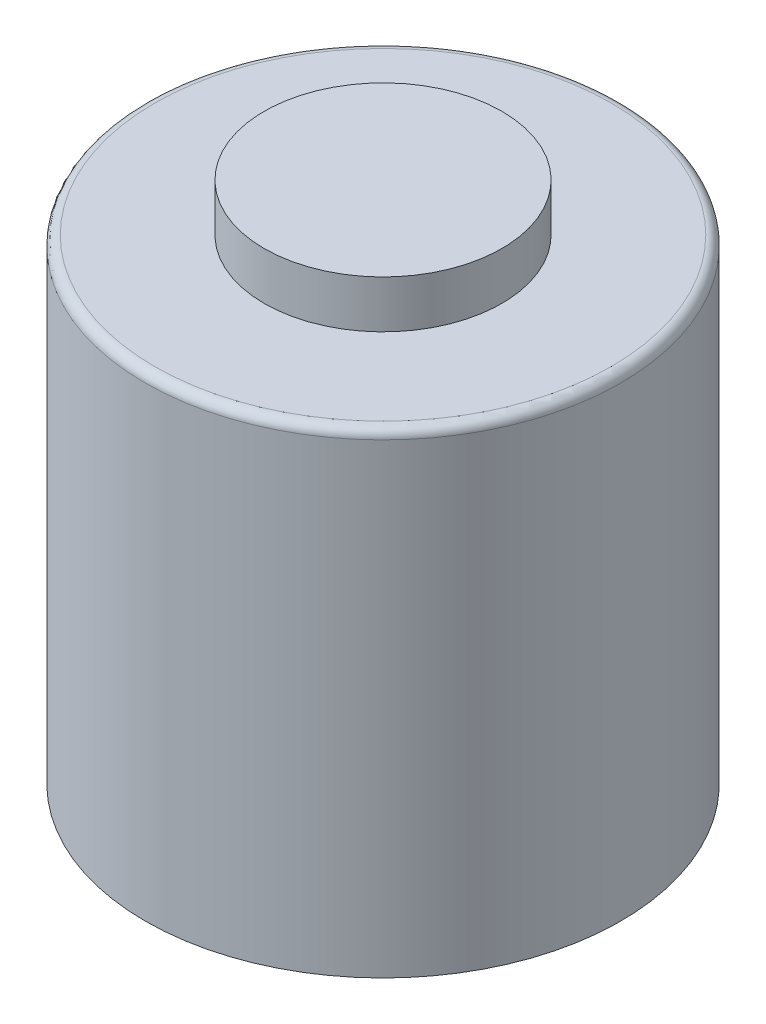
ISO-10303-21;
HEADER;
FILE_DESCRIPTION(('STEP AP214'),'2;1');
FILE_NAME('part.step','',(''),(''),'','','');
FILE_SCHEMA(('AUTOMOTIVE_DESIGN { 1 0 10303 214 1 1 1 1 }'));
ENDSEC;
DATA;
#1=APPLICATION_CONTEXT('core data for automotive mechanical design processes');
#2=APPLICATION_PROTOCOL_DEFINITION('international standard','automotive_design',2000,#1);
#3=PRODUCT_CONTEXT('',#1,'mechanical');
#4=PRODUCT('Part','Part','',(#3));
#5=PRODUCT_RELATED_PRODUCT_CATEGORY('part','',(#4));
#6=PRODUCT_DEFINITION_FORMATION('','',#4);
#7=PRODUCT_DEFINITION_CONTEXT('part definition',#1,'design');
#8=PRODUCT_DEFINITION('design','',#6,#7);
#9=PRODUCT_DEFINITION_SHAPE('','',#8);
#10=(LENGTH_UNIT() NAMED_UNIT(*) SI_UNIT(.MILLI.,.METRE.));
#11=(NAMED_UNIT(*) PLANE_ANGLE_UNIT() SI_UNIT($,.RADIAN.));
#12=(NAMED_UNIT(*) SI_UNIT($,.STERADIAN.) SOLID_ANGLE_UNIT());
#13=UNCERTAINTY_MEASURE_WITH_UNIT(LENGTH_MEASURE(1.E-05),#10,'distance_accuracy_value','');
#14=(GEOMETRIC_REPRESENTATION_CONTEXT(3) GLOBAL_UNCERTAINTY_ASSIGNED_CONTEXT((#13)) GLOBAL_UNIT_ASSIGNED_CONTEXT((#10,
#11,#12)) REPRESENTATION_CONTEXT('',''));
#15=CARTESIAN_POINT('',(0.,0.,0.));
#16=DIRECTION('',(0.,0.,1.));
#17=DIRECTION('',(1.,0.,0.));
#18=AXIS2_PLACEMENT_3D('',#15,#16,#17);
#19=CARTESIAN_POINT('',(0.,500.,0.));
#20=DIRECTION('',(0.,-1.,0.));
#21=DIRECTION('',(0.,0.,-1.));
#22=AXIS2_PLACEMENT_3D('',#19,#20,#21);
#23=CYLINDRICAL_SURFACE('',#22,250.);
#24=CARTESIAN_POINT('',(0.,490.,0.));
#25=DIRECTION('',(0.,1.,0.));
#26=DIRECTION('',(0.,0.,1.));
#27=AXIS2_PLACEMENT_3D('',#24,#25,#26);
#28=CIRCLE('',#27,250.);
#29=CARTESIAN_POINT('',(0.,490.,250.));
#30=VERTEX_POINT('',#29);
#31=EDGE_CURVE('E10',#30,#30,#28,.F.);
#32=ORIENTED_EDGE('',*,*,#31,.T.);
#33=EDGE_LOOP('',(#32));
#34=FACE_BOUND('',#33,.T.);
#35=CARTESIAN_POINT('',(0.,0.,0.));
#36=DIRECTION('',(0.,1.,0.));
#37=DIRECTION('',(0.,0.,1.));
#38=AXIS2_PLACEMENT_3D('',#35,#36,#37);
#39=CIRCLE('',#38,250.);
#40=CARTESIAN_POINT('',(0.,0.,250.));
#41=VERTEX_POINT('',#40);
#42=EDGE_CURVE('E52',#41,#41,#39,.T.);
#43=ORIENTED_EDGE('',*,*,#42,.T.);
#44=EDGE_LOOP('',(#43));
#45=FACE_BOUND('',#44,.T.);
#46=ADVANCED_FACE('F37',(#34,#45),#23,.T.);
#47=CARTESIAN_POINT('',(0.,500.,0.));
#48=DIRECTION('',(0.,1.,0.));
#49=DIRECTION('',(0.,0.,1.));
#50=AXIS2_PLACEMENT_3D('',#47,#48,#49);
#51=PLANE('',#50);
#52=CARTESIAN_POINT('',(0.,500.,0.));
#53=DIRECTION('',(0.,1.,0.));
#54=DIRECTION('',(0.,0.,1.));
#55=AXIS2_PLACEMENT_3D('',#52,#53,#54);
#56=CIRCLE('',#55,240.);
#57=CARTESIAN_POINT('',(0.,500.,240.));
#58=VERTEX_POINT('',#57);
#59=EDGE_CURVE('E44',#58,#58,#56,.T.);
#60=ORIENTED_EDGE('',*,*,#59,.T.);
#61=EDGE_LOOP('',(#60));
#62=FACE_BOUND('',#61,.T.);
#63=CARTESIAN_POINT('',(0.,500.,0.));
#64=DIRECTION('',(0.,1.,0.));
#65=DIRECTION('',(0.,0.,1.));
#66=AXIS2_PLACEMENT_3D('',#63,#64,#65);
#67=CIRCLE('',#66,125.);
#68=CARTESIAN_POINT('',(0.,500.,125.));
#69=VERTEX_POINT('',#68);
#70=EDGE_CURVE('E48',#69,#69,#67,.T.);
#71=ORIENTED_EDGE('',*,*,#70,.F.);
#72=EDGE_LOOP('',(#71));
#73=FACE_BOUND('',#72,.T.);
#74=ADVANCED_FACE('F70',(#62,#73),#51,.T.);
#75=CARTESIAN_POINT('',(0.,0.,0.));
#76=DIRECTION('',(0.,1.,0.));
#77=DIRECTION('',(0.,0.,1.));
#78=AXIS2_PLACEMENT_3D('',#75,#76,#77);
#79=PLANE('',#78);
#80=ORIENTED_EDGE('',*,*,#42,.F.);
#81=EDGE_LOOP('',(#80));
#82=FACE_BOUND('',#81,.T.);
#83=ADVANCED_FACE('F66',(#82),#79,.F.);
#84=CARTESIAN_POINT('',(0.,550.,0.));
#85=DIRECTION('',(0.,-1.,0.));
#86=DIRECTION('',(0.,0.,-1.));
#87=AXIS2_PLACEMENT_3D('',#84,#85,#86);
#88=CYLINDRICAL_SURFACE('',#87,125.);
#89=CARTESIAN_POINT('',(0.,550.,0.));
#90=DIRECTION('',(0.,1.,0.));
#91=DIRECTION('',(0.,0.,1.));
#92=AXIS2_PLACEMENT_3D('',#89,#90,#91);
#93=CIRCLE('',#92,125.);
#94=CARTESIAN_POINT('',(0.,550.,125.));
#95=VERTEX_POINT('',#94);
#96=EDGE_CURVE('E56',#95,#95,#93,.T.);
#97=ORIENTED_EDGE('',*,*,#96,.F.);
#98=EDGE_LOOP('',(#97));
#99=FACE_BOUND('',#98,.T.);
#100=ORIENTED_EDGE('',*,*,#70,.T.);
#101=EDGE_LOOP('',(#100));
#102=FACE_BOUND('',#101,.T.);
#103=ADVANCED_FACE('F63',(#99,#102),#88,.T.);
#104=CARTESIAN_POINT('',(0.,550.,0.));
#105=DIRECTION('',(0.,1.,0.));
#106=DIRECTION('',(0.,0.,1.));
#107=AXIS2_PLACEMENT_3D('',#104,#105,#106);
#108=PLANE('',#107);
#109=ORIENTED_EDGE('',*,*,#96,.T.);
#110=EDGE_LOOP('',(#109));
#111=FACE_BOUND('',#110,.T.);
#112=ADVANCED_FACE('F61',(#111),#108,.T.);
#113=CARTESIAN_POINT('',(0.,490.,0.));
#114=DIRECTION('',(0.,1.,0.));
#115=DIRECTION('',(0.,0.,1.));
#116=AXIS2_PLACEMENT_3D('',#113,#114,#115);
#117=TOROIDAL_SURFACE('',#116,240.,10.);
#118=ORIENTED_EDGE('',*,*,#31,.F.);
#119=EDGE_LOOP('',(#118));
#120=FACE_BOUND('',#119,.T.);
#121=ORIENTED_EDGE('',*,*,#59,.F.);
#122=EDGE_LOOP('',(#121));
#123=FACE_BOUND('',#122,.T.);
#124=ADVANCED_FACE('F39',(#120,#123),#117,.T.);
#125=CLOSED_SHELL('',(#46,#74,#83,#103,#112,#124));
#126=MANIFOLD_SOLID_BREP('B2',#125);
#127=ADVANCED_BREP_SHAPE_REPRESENTATION('',(#18,#126),#14);
#128=SHAPE_DEFINITION_REPRESENTATION(#9,#127);
ENDSEC;
END-ISO-10303-21;
